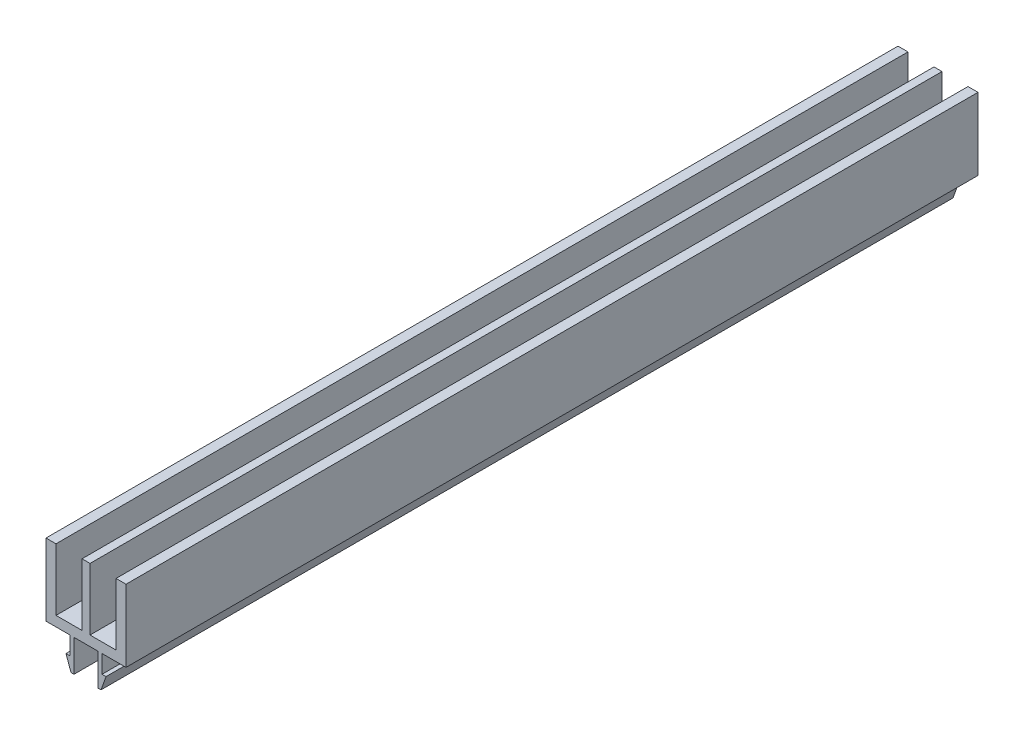
ISO-10303-21;
HEADER;
FILE_DESCRIPTION(('STEP AP214'),'2;1');
FILE_NAME('part.step','',(''),(''),'','','');
FILE_SCHEMA(('AUTOMOTIVE_DESIGN { 1 0 10303 214 1 1 1 1 }'));
ENDSEC;
DATA;
#1=APPLICATION_CONTEXT('core data for automotive mechanical design processes');
#2=APPLICATION_PROTOCOL_DEFINITION('international standard','automotive_design',2000,#1);
#3=PRODUCT_CONTEXT('',#1,'mechanical');
#4=PRODUCT('Part','Part','',(#3));
#5=PRODUCT_RELATED_PRODUCT_CATEGORY('part','',(#4));
#6=PRODUCT_DEFINITION_FORMATION('','',#4);
#7=PRODUCT_DEFINITION_CONTEXT('part definition',#1,'design');
#8=PRODUCT_DEFINITION('design','',#6,#7);
#9=PRODUCT_DEFINITION_SHAPE('','',#8);
#10=(LENGTH_UNIT() NAMED_UNIT(*) SI_UNIT(.MILLI.,.METRE.));
#11=(NAMED_UNIT(*) PLANE_ANGLE_UNIT() SI_UNIT($,.RADIAN.));
#12=(NAMED_UNIT(*) SI_UNIT($,.STERADIAN.) SOLID_ANGLE_UNIT());
#13=UNCERTAINTY_MEASURE_WITH_UNIT(LENGTH_MEASURE(1.E-05),#10,'distance_accuracy_value','');
#14=(GEOMETRIC_REPRESENTATION_CONTEXT(3) GLOBAL_UNCERTAINTY_ASSIGNED_CONTEXT((#13)) GLOBAL_UNIT_ASSIGNED_CONTEXT((#10,
#11,#12)) REPRESENTATION_CONTEXT('',''));
#15=CARTESIAN_POINT('',(0.,0.,0.));
#16=DIRECTION('',(0.,0.,1.));
#17=DIRECTION('',(1.,0.,0.));
#18=AXIS2_PLACEMENT_3D('',#15,#16,#17);
#19=CARTESIAN_POINT('',(-1.,17.9999999975,-162.95));
#20=DIRECTION('',(-1.,0.,0.));
#21=DIRECTION('',(0.,-1.,0.));
#22=AXIS2_PLACEMENT_3D('',#19,#20,#21);
#23=PLANE('',#22);
#24=DIRECTION('',(0.,-1.,0.));
#25=VECTOR('',#24,1.);
#26=CARTESIAN_POINT('',(-1.,17.9999999975,50.));
#27=LINE('',#26,#25);
#28=CARTESIAN_POINT('',(-1.,17.9999999975,50.));
#29=VERTEX_POINT('',#28);
#30=CARTESIAN_POINT('',(-1.,2.4999999995,50.));
#31=VERTEX_POINT('',#30);
#32=EDGE_CURVE('E226',#29,#31,#27,.T.);
#33=ORIENTED_EDGE('',*,*,#32,.F.);
#34=DIRECTION('',(0.,0.,1.));
#35=VECTOR('',#34,1.);
#36=CARTESIAN_POINT('',(-1.,17.9999999975,-162.95));
#37=LINE('',#36,#35);
#38=CARTESIAN_POINT('',(-1.,17.9999999975,-162.95));
#39=VERTEX_POINT('',#38);
#40=EDGE_CURVE('E11',#39,#29,#37,.T.);
#41=ORIENTED_EDGE('',*,*,#40,.F.);
#42=DIRECTION('',(0.,-1.,0.));
#43=VECTOR('',#42,1.);
#44=CARTESIAN_POINT('',(-1.,17.9999999975,-162.95));
#45=LINE('',#44,#43);
#46=CARTESIAN_POINT('',(-1.,2.4999999995,-162.95));
#47=VERTEX_POINT('',#46);
#48=EDGE_CURVE('E294',#39,#47,#45,.T.);
#49=ORIENTED_EDGE('',*,*,#48,.T.);
#50=DIRECTION('',(0.,0.,1.));
#51=VECTOR('',#50,1.);
#52=CARTESIAN_POINT('',(-1.,2.4999999995,-162.95));
#53=LINE('',#52,#51);
#54=EDGE_CURVE('E36',#47,#31,#53,.T.);
#55=ORIENTED_EDGE('',*,*,#54,.T.);
#56=EDGE_LOOP('',(#33,#41,#49,#55));
#57=FACE_BOUND('',#56,.T.);
#58=ADVANCED_FACE('F33',(#57),#23,.T.);
#59=CARTESIAN_POINT('',(0.999999999999998,17.9999999975,-162.95));
#60=DIRECTION('',(0.,1.,0.));
#61=DIRECTION('',(0.,0.,1.));
#62=AXIS2_PLACEMENT_3D('',#59,#60,#61);
#63=PLANE('',#62);
#64=DIRECTION('',(-1.,0.,0.));
#65=VECTOR('',#64,1.);
#66=CARTESIAN_POINT('',(0.999999999999998,17.9999999975,50.));
#67=LINE('',#66,#65);
#68=CARTESIAN_POINT('',(0.999999999999998,17.9999999975,50.));
#69=VERTEX_POINT('',#68);
#70=EDGE_CURVE('E292',#69,#29,#67,.T.);
#71=ORIENTED_EDGE('',*,*,#70,.F.);
#72=DIRECTION('',(0.,0.,1.));
#73=VECTOR('',#72,1.);
#74=CARTESIAN_POINT('',(0.999999999999998,17.9999999975,-162.95));
#75=LINE('',#74,#73);
#76=CARTESIAN_POINT('',(0.999999999999998,17.9999999975,-162.95));
#77=VERTEX_POINT('',#76);
#78=EDGE_CURVE('E42',#77,#69,#75,.T.);
#79=ORIENTED_EDGE('',*,*,#78,.F.);
#80=DIRECTION('',(-1.,0.,0.));
#81=VECTOR('',#80,1.);
#82=CARTESIAN_POINT('',(0.999999999999998,17.9999999975,-162.95));
#83=LINE('',#82,#81);
#84=EDGE_CURVE('E216',#77,#39,#83,.T.);
#85=ORIENTED_EDGE('',*,*,#84,.T.);
#86=ORIENTED_EDGE('',*,*,#40,.T.);
#87=EDGE_LOOP('',(#71,#79,#85,#86));
#88=FACE_BOUND('',#87,.T.);
#89=ADVANCED_FACE('F338',(#88),#63,.T.);
#90=CARTESIAN_POINT('',(0.999999999999998,2.4999999995,-162.95));
#91=DIRECTION('',(1.,0.,0.));
#92=DIRECTION('',(0.,0.,-1.));
#93=AXIS2_PLACEMENT_3D('',#90,#91,#92);
#94=PLANE('',#93);
#95=DIRECTION('',(0.,1.,0.));
#96=VECTOR('',#95,1.);
#97=CARTESIAN_POINT('',(0.999999999999998,2.4999999995,50.));
#98=LINE('',#97,#96);
#99=CARTESIAN_POINT('',(0.999999999999998,2.4999999995,50.));
#100=VERTEX_POINT('',#99);
#101=EDGE_CURVE('E203',#100,#69,#98,.T.);
#102=ORIENTED_EDGE('',*,*,#101,.F.);
#103=DIRECTION('',(0.,0.,1.));
#104=VECTOR('',#103,1.);
#105=CARTESIAN_POINT('',(0.999999999999998,2.4999999995,-162.95));
#106=LINE('',#105,#104);
#107=CARTESIAN_POINT('',(0.999999999999998,2.4999999995,-162.95));
#108=VERTEX_POINT('',#107);
#109=EDGE_CURVE('E198',#108,#100,#106,.T.);
#110=ORIENTED_EDGE('',*,*,#109,.F.);
#111=DIRECTION('',(0.,1.,0.));
#112=VECTOR('',#111,1.);
#113=CARTESIAN_POINT('',(0.999999999999998,2.4999999995,-162.95));
#114=LINE('',#113,#112);
#115=EDGE_CURVE('E201',#108,#77,#114,.T.);
#116=ORIENTED_EDGE('',*,*,#115,.T.);
#117=ORIENTED_EDGE('',*,*,#78,.T.);
#118=EDGE_LOOP('',(#102,#110,#116,#117));
#119=FACE_BOUND('',#118,.T.);
#120=ADVANCED_FACE('F200',(#119),#94,.T.);
#121=CARTESIAN_POINT('',(7.5,2.4999999995,-162.95));
#122=DIRECTION('',(0.,1.,0.));
#123=DIRECTION('',(-1.,0.,0.));
#124=AXIS2_PLACEMENT_3D('',#121,#122,#123);
#125=PLANE('',#124);
#126=DIRECTION('',(-1.,0.,0.));
#127=VECTOR('',#126,1.);
#128=CARTESIAN_POINT('',(7.5,2.4999999995,50.));
#129=LINE('',#128,#127);
#130=CARTESIAN_POINT('',(7.5,2.4999999995,50.));
#131=VERTEX_POINT('',#130);
#132=EDGE_CURVE('E289',#131,#100,#129,.T.);
#133=ORIENTED_EDGE('',*,*,#132,.F.);
#134=DIRECTION('',(0.,0.,1.));
#135=VECTOR('',#134,1.);
#136=CARTESIAN_POINT('',(7.5,2.4999999995,-162.95));
#137=LINE('',#136,#135);
#138=CARTESIAN_POINT('',(7.5,2.4999999995,-162.95));
#139=VERTEX_POINT('',#138);
#140=EDGE_CURVE('E208',#139,#131,#137,.T.);
#141=ORIENTED_EDGE('',*,*,#140,.F.);
#142=DIRECTION('',(-1.,0.,0.));
#143=VECTOR('',#142,1.);
#144=CARTESIAN_POINT('',(7.5,2.4999999995,-162.95));
#145=LINE('',#144,#143);
#146=EDGE_CURVE('E214',#139,#108,#145,.T.);
#147=ORIENTED_EDGE('',*,*,#146,.T.);
#148=ORIENTED_EDGE('',*,*,#109,.T.);
#149=EDGE_LOOP('',(#133,#141,#147,#148));
#150=FACE_BOUND('',#149,.T.);
#151=ADVANCED_FACE('F218',(#150),#125,.T.);
#152=CARTESIAN_POINT('',(7.5,17.9999999975,-162.95));
#153=DIRECTION('',(-1.,0.,0.));
#154=DIRECTION('',(0.,-1.,0.));
#155=AXIS2_PLACEMENT_3D('',#152,#153,#154);
#156=PLANE('',#155);
#157=DIRECTION('',(0.,-1.,0.));
#158=VECTOR('',#157,1.);
#159=CARTESIAN_POINT('',(7.5,17.9999999975,50.));
#160=LINE('',#159,#158);
#161=CARTESIAN_POINT('',(7.5,17.9999999975,50.));
#162=VERTEX_POINT('',#161);
#163=EDGE_CURVE('E286',#162,#131,#160,.T.);
#164=ORIENTED_EDGE('',*,*,#163,.F.);
#165=DIRECTION('',(0.,0.,1.));
#166=VECTOR('',#165,1.);
#167=CARTESIAN_POINT('',(7.5,17.9999999975,-162.95));
#168=LINE('',#167,#166);
#169=CARTESIAN_POINT('',(7.5,17.9999999975,-162.95));
#170=VERTEX_POINT('',#169);
#171=EDGE_CURVE('E298',#170,#162,#168,.T.);
#172=ORIENTED_EDGE('',*,*,#171,.F.);
#173=DIRECTION('',(0.,-1.,0.));
#174=VECTOR('',#173,1.);
#175=CARTESIAN_POINT('',(7.5,17.9999999975,-162.95));
#176=LINE('',#175,#174);
#177=EDGE_CURVE('E219',#170,#139,#176,.T.);
#178=ORIENTED_EDGE('',*,*,#177,.T.);
#179=ORIENTED_EDGE('',*,*,#140,.T.);
#180=EDGE_LOOP('',(#164,#172,#178,#179));
#181=FACE_BOUND('',#180,.T.);
#182=ADVANCED_FACE('F351',(#181),#156,.T.);
#183=CARTESIAN_POINT('',(10.,17.9999999975,-162.95));
#184=DIRECTION('',(0.,1.,0.));
#185=DIRECTION('',(0.,0.,1.));
#186=AXIS2_PLACEMENT_3D('',#183,#184,#185);
#187=PLANE('',#186);
#188=DIRECTION('',(-1.,0.,0.));
#189=VECTOR('',#188,1.);
#190=CARTESIAN_POINT('',(10.,17.9999999975,50.));
#191=LINE('',#190,#189);
#192=CARTESIAN_POINT('',(10.,17.9999999975,50.));
#193=VERTEX_POINT('',#192);
#194=EDGE_CURVE('E283',#193,#162,#191,.T.);
#195=ORIENTED_EDGE('',*,*,#194,.F.);
#196=DIRECTION('',(0.,0.,1.));
#197=VECTOR('',#196,1.);
#198=CARTESIAN_POINT('',(10.,17.9999999975,-162.95));
#199=LINE('',#198,#197);
#200=CARTESIAN_POINT('',(10.,17.9999999975,-162.95));
#201=VERTEX_POINT('',#200);
#202=EDGE_CURVE('E300',#201,#193,#199,.T.);
#203=ORIENTED_EDGE('',*,*,#202,.F.);
#204=DIRECTION('',(-1.,0.,0.));
#205=VECTOR('',#204,1.);
#206=CARTESIAN_POINT('',(10.,17.9999999975,-162.95));
#207=LINE('',#206,#205);
#208=EDGE_CURVE('E221',#201,#170,#207,.T.);
#209=ORIENTED_EDGE('',*,*,#208,.T.);
#210=ORIENTED_EDGE('',*,*,#171,.T.);
#211=EDGE_LOOP('',(#195,#203,#209,#210));
#212=FACE_BOUND('',#211,.T.);
#213=ADVANCED_FACE('F354',(#212),#187,.T.);
#214=CARTESIAN_POINT('',(10.,-4.99999828349541E-10,-162.95));
#215=DIRECTION('',(1.,0.,0.));
#216=DIRECTION('',(0.,0.,-1.));
#217=AXIS2_PLACEMENT_3D('',#214,#215,#216);
#218=PLANE('',#217);
#219=DIRECTION('',(0.,1.,0.));
#220=VECTOR('',#219,1.);
#221=CARTESIAN_POINT('',(10.,-4.99999828349541E-10,50.));
#222=LINE('',#221,#220);
#223=CARTESIAN_POINT('',(10.,-4.99999828349541E-10,50.));
#224=VERTEX_POINT('',#223);
#225=EDGE_CURVE('E280',#224,#193,#222,.T.);
#226=ORIENTED_EDGE('',*,*,#225,.F.);
#227=DIRECTION('',(0.,0.,1.));
#228=VECTOR('',#227,1.);
#229=CARTESIAN_POINT('',(10.,-4.99999828349541E-10,-162.95));
#230=LINE('',#229,#228);
#231=CARTESIAN_POINT('',(10.,-4.99999828349541E-10,-162.95));
#232=VERTEX_POINT('',#231);
#233=EDGE_CURVE('E302',#232,#224,#230,.T.);
#234=ORIENTED_EDGE('',*,*,#233,.F.);
#235=DIRECTION('',(0.,1.,0.));
#236=VECTOR('',#235,1.);
#237=CARTESIAN_POINT('',(10.,-4.99999828349541E-10,-162.95));
#238=LINE('',#237,#236);
#239=EDGE_CURVE('E644',#232,#201,#238,.T.);
#240=ORIENTED_EDGE('',*,*,#239,.T.);
#241=ORIENTED_EDGE('',*,*,#202,.T.);
#242=EDGE_LOOP('',(#226,#234,#240,#241));
#243=FACE_BOUND('',#242,.T.);
#244=ADVANCED_FACE('F358',(#243),#218,.T.);
#245=CARTESIAN_POINT('',(4.,-4.99999998002099E-10,-162.95));
#246=DIRECTION('',(0.,-1.,0.));
#247=DIRECTION('',(1.,0.,0.));
#248=AXIS2_PLACEMENT_3D('',#245,#246,#247);
#249=PLANE('',#248);
#250=DIRECTION('',(1.,0.,0.));
#251=VECTOR('',#250,1.);
#252=CARTESIAN_POINT('',(4.,-4.99999998002099E-10,50.));
#253=LINE('',#252,#251);
#254=CARTESIAN_POINT('',(4.,-4.99999998002099E-10,50.));
#255=VERTEX_POINT('',#254);
#256=EDGE_CURVE('E277',#255,#224,#253,.T.);
#257=ORIENTED_EDGE('',*,*,#256,.F.);
#258=DIRECTION('',(0.,0.,1.));
#259=VECTOR('',#258,1.);
#260=CARTESIAN_POINT('',(4.,-4.99999998002099E-10,-162.95));
#261=LINE('',#260,#259);
#262=CARTESIAN_POINT('',(4.,-4.99999998002099E-10,-162.95));
#263=VERTEX_POINT('',#262);
#264=EDGE_CURVE('E304',#263,#255,#261,.T.);
#265=ORIENTED_EDGE('',*,*,#264,.F.);
#266=DIRECTION('',(1.,0.,0.));
#267=VECTOR('',#266,1.);
#268=CARTESIAN_POINT('',(4.,-4.99999998002099E-10,-162.95));
#269=LINE('',#268,#267);
#270=EDGE_CURVE('E648',#263,#232,#269,.T.);
#271=ORIENTED_EDGE('',*,*,#270,.T.);
#272=ORIENTED_EDGE('',*,*,#233,.T.);
#273=EDGE_LOOP('',(#257,#265,#271,#272));
#274=FACE_BOUND('',#273,.T.);
#275=ADVANCED_FACE('F362',(#274),#249,.T.);
#276=CARTESIAN_POINT('',(4.,-4.5,-162.95));
#277=DIRECTION('',(1.,0.,0.));
#278=DIRECTION('',(0.,0.,-1.));
#279=AXIS2_PLACEMENT_3D('',#276,#277,#278);
#280=PLANE('',#279);
#281=DIRECTION('',(0.,1.,0.));
#282=VECTOR('',#281,1.);
#283=CARTESIAN_POINT('',(4.,-4.5,50.));
#284=LINE('',#283,#282);
#285=CARTESIAN_POINT('',(4.,-4.5,50.));
#286=VERTEX_POINT('',#285);
#287=EDGE_CURVE('E274',#286,#255,#284,.T.);
#288=ORIENTED_EDGE('',*,*,#287,.F.);
#289=DIRECTION('',(0.,0.,1.));
#290=VECTOR('',#289,1.);
#291=CARTESIAN_POINT('',(4.,-4.5,-162.95));
#292=LINE('',#291,#290);
#293=CARTESIAN_POINT('',(4.,-4.5,-162.95));
#294=VERTEX_POINT('',#293);
#295=EDGE_CURVE('E306',#294,#286,#292,.T.);
#296=ORIENTED_EDGE('',*,*,#295,.F.);
#297=DIRECTION('',(0.,1.,0.));
#298=VECTOR('',#297,1.);
#299=CARTESIAN_POINT('',(4.,-4.5,-162.95));
#300=LINE('',#299,#298);
#301=EDGE_CURVE('E637',#294,#263,#300,.T.);
#302=ORIENTED_EDGE('',*,*,#301,.T.);
#303=ORIENTED_EDGE('',*,*,#264,.T.);
#304=EDGE_LOOP('',(#288,#296,#302,#303));
#305=FACE_BOUND('',#304,.T.);
#306=ADVANCED_FACE('F366',(#305),#280,.T.);
#307=CARTESIAN_POINT('',(5.,-4.5,-162.95));
#308=DIRECTION('',(0.,1.,0.));
#309=DIRECTION('',(0.,0.,1.));
#310=AXIS2_PLACEMENT_3D('',#307,#308,#309);
#311=PLANE('',#310);
#312=DIRECTION('',(-1.,0.,0.));
#313=VECTOR('',#312,1.);
#314=CARTESIAN_POINT('',(5.,-4.5,50.));
#315=LINE('',#314,#313);
#316=CARTESIAN_POINT('',(5.,-4.5,50.));
#317=VERTEX_POINT('',#316);
#318=EDGE_CURVE('E271',#317,#286,#315,.T.);
#319=ORIENTED_EDGE('',*,*,#318,.F.);
#320=DIRECTION('',(0.,0.,1.));
#321=VECTOR('',#320,1.);
#322=CARTESIAN_POINT('',(5.,-4.5,-162.95));
#323=LINE('',#322,#321);
#324=CARTESIAN_POINT('',(5.,-4.5,-162.95));
#325=VERTEX_POINT('',#324);
#326=EDGE_CURVE('E308',#325,#317,#323,.T.);
#327=ORIENTED_EDGE('',*,*,#326,.F.);
#328=DIRECTION('',(-1.,0.,0.));
#329=VECTOR('',#328,1.);
#330=CARTESIAN_POINT('',(5.,-4.5,-162.95));
#331=LINE('',#330,#329);
#332=EDGE_CURVE('E633',#325,#294,#331,.T.);
#333=ORIENTED_EDGE('',*,*,#332,.T.);
#334=ORIENTED_EDGE('',*,*,#295,.T.);
#335=EDGE_LOOP('',(#319,#327,#333,#334));
#336=FACE_BOUND('',#335,.T.);
#337=ADVANCED_FACE('F370',(#336),#311,.T.);
#338=CARTESIAN_POINT('',(3.75,-8.,-162.95));
#339=DIRECTION('',(0.941741911594837,-0.336336396998157,0.));
#340=DIRECTION('',(0.336336396998157,0.941741911594837,0.));
#341=AXIS2_PLACEMENT_3D('',#338,#339,#340);
#342=PLANE('',#341);
#343=DIRECTION('',(0.336336396998157,0.941741911594837,0.));
#344=VECTOR('',#343,1.);
#345=CARTESIAN_POINT('',(3.75,-8.,50.));
#346=LINE('',#345,#344);
#347=CARTESIAN_POINT('',(3.75,-8.,50.));
#348=VERTEX_POINT('',#347);
#349=EDGE_CURVE('E268',#348,#317,#346,.T.);
#350=ORIENTED_EDGE('',*,*,#349,.F.);
#351=DIRECTION('',(0.,0.,1.));
#352=VECTOR('',#351,1.);
#353=CARTESIAN_POINT('',(3.75,-8.,-162.95));
#354=LINE('',#353,#352);
#355=CARTESIAN_POINT('',(3.75,-8.,-162.95));
#356=VERTEX_POINT('',#355);
#357=EDGE_CURVE('E310',#356,#348,#354,.T.);
#358=ORIENTED_EDGE('',*,*,#357,.F.);
#359=DIRECTION('',(0.336336396998157,0.941741911594837,0.));
#360=VECTOR('',#359,1.);
#361=CARTESIAN_POINT('',(3.75,-8.,-162.95));
#362=LINE('',#361,#360);
#363=EDGE_CURVE('E654',#356,#325,#362,.T.);
#364=ORIENTED_EDGE('',*,*,#363,.T.);
#365=ORIENTED_EDGE('',*,*,#326,.T.);
#366=EDGE_LOOP('',(#350,#358,#364,#365));
#367=FACE_BOUND('',#366,.T.);
#368=ADVANCED_FACE('F374',(#367),#342,.T.);
#369=CARTESIAN_POINT('',(3.,-8.,-162.95));
#370=DIRECTION('',(0.,-1.,0.));
#371=DIRECTION('',(0.,0.,-1.));
#372=AXIS2_PLACEMENT_3D('',#369,#370,#371);
#373=PLANE('',#372);
#374=DIRECTION('',(1.,0.,0.));
#375=VECTOR('',#374,1.);
#376=CARTESIAN_POINT('',(3.,-8.,50.));
#377=LINE('',#376,#375);
#378=CARTESIAN_POINT('',(3.,-8.,50.));
#379=VERTEX_POINT('',#378);
#380=EDGE_CURVE('E265',#379,#348,#377,.T.);
#381=ORIENTED_EDGE('',*,*,#380,.F.);
#382=DIRECTION('',(0.,0.,1.));
#383=VECTOR('',#382,1.);
#384=CARTESIAN_POINT('',(3.,-8.,-162.95));
#385=LINE('',#384,#383);
#386=CARTESIAN_POINT('',(3.,-8.,-162.95));
#387=VERTEX_POINT('',#386);
#388=EDGE_CURVE('E312',#387,#379,#385,.T.);
#389=ORIENTED_EDGE('',*,*,#388,.F.);
#390=DIRECTION('',(1.,0.,0.));
#391=VECTOR('',#390,1.);
#392=CARTESIAN_POINT('',(3.,-8.,-162.95));
#393=LINE('',#392,#391);
#394=EDGE_CURVE('E626',#387,#356,#393,.T.);
#395=ORIENTED_EDGE('',*,*,#394,.T.);
#396=ORIENTED_EDGE('',*,*,#357,.T.);
#397=EDGE_LOOP('',(#381,#389,#395,#396));
#398=FACE_BOUND('',#397,.T.);
#399=ADVANCED_FACE('F378',(#398),#373,.T.);
#400=CARTESIAN_POINT('',(3.,-4.9999985194348E-10,-162.95));
#401=DIRECTION('',(-1.,0.,0.));
#402=DIRECTION('',(0.,0.,1.));
#403=AXIS2_PLACEMENT_3D('',#400,#401,#402);
#404=PLANE('',#403);
#405=DIRECTION('',(0.,-1.,0.));
#406=VECTOR('',#405,1.);
#407=CARTESIAN_POINT('',(3.,-4.9999985194348E-10,50.));
#408=LINE('',#407,#406);
#409=CARTESIAN_POINT('',(3.,-4.9999985194348E-10,50.));
#410=VERTEX_POINT('',#409);
#411=EDGE_CURVE('E262',#410,#379,#408,.T.);
#412=ORIENTED_EDGE('',*,*,#411,.F.);
#413=DIRECTION('',(0.,0.,1.));
#414=VECTOR('',#413,1.);
#415=CARTESIAN_POINT('',(3.,-4.9999985194348E-10,-162.95));
#416=LINE('',#415,#414);
#417=CARTESIAN_POINT('',(3.,-4.9999985194348E-10,-162.95));
#418=VERTEX_POINT('',#417);
#419=EDGE_CURVE('E314',#418,#410,#416,.T.);
#420=ORIENTED_EDGE('',*,*,#419,.F.);
#421=DIRECTION('',(0.,-1.,0.));
#422=VECTOR('',#421,1.);
#423=CARTESIAN_POINT('',(3.,-4.9999985194348E-10,-162.95));
#424=LINE('',#423,#422);
#425=EDGE_CURVE('E622',#418,#387,#424,.T.);
#426=ORIENTED_EDGE('',*,*,#425,.T.);
#427=ORIENTED_EDGE('',*,*,#388,.T.);
#428=EDGE_LOOP('',(#412,#420,#426,#427));
#429=FACE_BOUND('',#428,.T.);
#430=ADVANCED_FACE('F382',(#429),#404,.T.);
#431=CARTESIAN_POINT('',(-3.,-4.99999455901012E-10,-162.95));
#432=DIRECTION('',(0.,-1.,0.));
#433=DIRECTION('',(1.,0.,0.));
#434=AXIS2_PLACEMENT_3D('',#431,#432,#433);
#435=PLANE('',#434);
#436=DIRECTION('',(1.,0.,0.));
#437=VECTOR('',#436,1.);
#438=CARTESIAN_POINT('',(-3.,-4.99999455901012E-10,50.));
#439=LINE('',#438,#437);
#440=CARTESIAN_POINT('',(-3.,-4.99999455901012E-10,50.));
#441=VERTEX_POINT('',#440);
#442=EDGE_CURVE('E259',#441,#410,#439,.T.);
#443=ORIENTED_EDGE('',*,*,#442,.F.);
#444=DIRECTION('',(0.,0.,1.));
#445=VECTOR('',#444,1.);
#446=CARTESIAN_POINT('',(-3.,-4.99999455901012E-10,-162.95));
#447=LINE('',#446,#445);
#448=CARTESIAN_POINT('',(-3.,-4.99999455901012E-10,-162.95));
#449=VERTEX_POINT('',#448);
#450=EDGE_CURVE('E316',#449,#441,#447,.T.);
#451=ORIENTED_EDGE('',*,*,#450,.F.);
#452=DIRECTION('',(1.,0.,0.));
#453=VECTOR('',#452,1.);
#454=CARTESIAN_POINT('',(-3.,-4.99999455901012E-10,-162.95));
#455=LINE('',#454,#453);
#456=EDGE_CURVE('E658',#449,#418,#455,.T.);
#457=ORIENTED_EDGE('',*,*,#456,.T.);
#458=ORIENTED_EDGE('',*,*,#419,.T.);
#459=EDGE_LOOP('',(#443,#451,#457,#458));
#460=FACE_BOUND('',#459,.T.);
#461=ADVANCED_FACE('F386',(#460),#435,.T.);
#462=CARTESIAN_POINT('',(-3.,-8.,-162.95));
#463=DIRECTION('',(1.,0.,0.));
#464=DIRECTION('',(0.,0.,-1.));
#465=AXIS2_PLACEMENT_3D('',#462,#463,#464);
#466=PLANE('',#465);
#467=DIRECTION('',(0.,1.,0.));
#468=VECTOR('',#467,1.);
#469=CARTESIAN_POINT('',(-3.,-8.,50.));
#470=LINE('',#469,#468);
#471=CARTESIAN_POINT('',(-3.,-8.,50.));
#472=VERTEX_POINT('',#471);
#473=EDGE_CURVE('E256',#472,#441,#470,.T.);
#474=ORIENTED_EDGE('',*,*,#473,.F.);
#475=DIRECTION('',(0.,0.,1.));
#476=VECTOR('',#475,1.);
#477=CARTESIAN_POINT('',(-3.,-8.,-162.95));
#478=LINE('',#477,#476);
#479=CARTESIAN_POINT('',(-3.,-8.,-162.95));
#480=VERTEX_POINT('',#479);
#481=EDGE_CURVE('E318',#480,#472,#478,.T.);
#482=ORIENTED_EDGE('',*,*,#481,.F.);
#483=DIRECTION('',(0.,1.,0.));
#484=VECTOR('',#483,1.);
#485=CARTESIAN_POINT('',(-3.,-8.,-162.95));
#486=LINE('',#485,#484);
#487=EDGE_CURVE('E615',#480,#449,#486,.T.);
#488=ORIENTED_EDGE('',*,*,#487,.T.);
#489=ORIENTED_EDGE('',*,*,#450,.T.);
#490=EDGE_LOOP('',(#474,#482,#488,#489));
#491=FACE_BOUND('',#490,.T.);
#492=ADVANCED_FACE('F390',(#491),#466,.T.);
#493=CARTESIAN_POINT('',(-3.75,-8.,-162.95));
#494=DIRECTION('',(0.,-1.,0.));
#495=DIRECTION('',(0.,0.,-1.));
#496=AXIS2_PLACEMENT_3D('',#493,#494,#495);
#497=PLANE('',#496);
#498=DIRECTION('',(1.,0.,0.));
#499=VECTOR('',#498,1.);
#500=CARTESIAN_POINT('',(-3.75,-8.,50.));
#501=LINE('',#500,#499);
#502=CARTESIAN_POINT('',(-3.75,-8.,50.));
#503=VERTEX_POINT('',#502);
#504=EDGE_CURVE('E253',#503,#472,#501,.T.);
#505=ORIENTED_EDGE('',*,*,#504,.F.);
#506=DIRECTION('',(0.,0.,1.));
#507=VECTOR('',#506,1.);
#508=CARTESIAN_POINT('',(-3.75,-8.,-162.95));
#509=LINE('',#508,#507);
#510=CARTESIAN_POINT('',(-3.75,-8.,-162.95));
#511=VERTEX_POINT('',#510);
#512=EDGE_CURVE('E320',#511,#503,#509,.T.);
#513=ORIENTED_EDGE('',*,*,#512,.F.);
#514=DIRECTION('',(1.,0.,0.));
#515=VECTOR('',#514,1.);
#516=CARTESIAN_POINT('',(-3.75,-8.,-162.95));
#517=LINE('',#516,#515);
#518=EDGE_CURVE('E611',#511,#480,#517,.T.);
#519=ORIENTED_EDGE('',*,*,#518,.T.);
#520=ORIENTED_EDGE('',*,*,#481,.T.);
#521=EDGE_LOOP('',(#505,#513,#519,#520));
#522=FACE_BOUND('',#521,.T.);
#523=ADVANCED_FACE('F394',(#522),#497,.T.);
#524=CARTESIAN_POINT('',(-5.,-4.5,-162.95));
#525=DIRECTION('',(-0.941741911594837,-0.336336396998156,0.));
#526=DIRECTION('',(0.336336396998156,-0.941741911594837,0.));
#527=AXIS2_PLACEMENT_3D('',#524,#525,#526);
#528=PLANE('',#527);
#529=DIRECTION('',(0.336336396998156,-0.941741911594837,0.));
#530=VECTOR('',#529,1.);
#531=CARTESIAN_POINT('',(-5.,-4.5,50.));
#532=LINE('',#531,#530);
#533=CARTESIAN_POINT('',(-5.,-4.5,50.));
#534=VERTEX_POINT('',#533);
#535=EDGE_CURVE('E250',#534,#503,#532,.T.);
#536=ORIENTED_EDGE('',*,*,#535,.F.);
#537=DIRECTION('',(0.,0.,1.));
#538=VECTOR('',#537,1.);
#539=CARTESIAN_POINT('',(-5.,-4.5,-162.95));
#540=LINE('',#539,#538);
#541=CARTESIAN_POINT('',(-5.,-4.5,-162.95));
#542=VERTEX_POINT('',#541);
#543=EDGE_CURVE('E322',#542,#534,#540,.T.);
#544=ORIENTED_EDGE('',*,*,#543,.F.);
#545=DIRECTION('',(0.336336396998156,-0.941741911594837,0.));
#546=VECTOR('',#545,1.);
#547=CARTESIAN_POINT('',(-5.,-4.5,-162.95));
#548=LINE('',#547,#546);
#549=EDGE_CURVE('E662',#542,#511,#548,.T.);
#550=ORIENTED_EDGE('',*,*,#549,.T.);
#551=ORIENTED_EDGE('',*,*,#512,.T.);
#552=EDGE_LOOP('',(#536,#544,#550,#551));
#553=FACE_BOUND('',#552,.T.);
#554=ADVANCED_FACE('F398',(#553),#528,.T.);
#555=CARTESIAN_POINT('',(-4.,-4.5,-162.95));
#556=DIRECTION('',(0.,1.,0.));
#557=DIRECTION('',(0.,0.,1.));
#558=AXIS2_PLACEMENT_3D('',#555,#556,#557);
#559=PLANE('',#558);
#560=DIRECTION('',(-1.,0.,0.));
#561=VECTOR('',#560,1.);
#562=CARTESIAN_POINT('',(-4.,-4.5,50.));
#563=LINE('',#562,#561);
#564=CARTESIAN_POINT('',(-4.,-4.5,50.));
#565=VERTEX_POINT('',#564);
#566=EDGE_CURVE('E247',#565,#534,#563,.T.);
#567=ORIENTED_EDGE('',*,*,#566,.F.);
#568=DIRECTION('',(0.,0.,1.));
#569=VECTOR('',#568,1.);
#570=CARTESIAN_POINT('',(-4.,-4.5,-162.95));
#571=LINE('',#570,#569);
#572=CARTESIAN_POINT('',(-4.,-4.5,-162.95));
#573=VERTEX_POINT('',#572);
#574=EDGE_CURVE('E324',#573,#565,#571,.T.);
#575=ORIENTED_EDGE('',*,*,#574,.F.);
#576=DIRECTION('',(-1.,0.,0.));
#577=VECTOR('',#576,1.);
#578=CARTESIAN_POINT('',(-4.,-4.5,-162.95));
#579=LINE('',#578,#577);
#580=EDGE_CURVE('E604',#573,#542,#579,.T.);
#581=ORIENTED_EDGE('',*,*,#580,.T.);
#582=ORIENTED_EDGE('',*,*,#543,.T.);
#583=EDGE_LOOP('',(#567,#575,#581,#582));
#584=FACE_BOUND('',#583,.T.);
#585=ADVANCED_FACE('F402',(#584),#559,.T.);
#586=CARTESIAN_POINT('',(-4.,-4.9999985194348E-10,-162.95));
#587=DIRECTION('',(-1.,0.,0.));
#588=DIRECTION('',(0.,0.,1.));
#589=AXIS2_PLACEMENT_3D('',#586,#587,#588);
#590=PLANE('',#589);
#591=DIRECTION('',(0.,-1.,0.));
#592=VECTOR('',#591,1.);
#593=CARTESIAN_POINT('',(-4.,-4.9999985194348E-10,50.));
#594=LINE('',#593,#592);
#595=CARTESIAN_POINT('',(-4.,-4.9999985194348E-10,50.));
#596=VERTEX_POINT('',#595);
#597=EDGE_CURVE('E244',#596,#565,#594,.T.);
#598=ORIENTED_EDGE('',*,*,#597,.F.);
#599=DIRECTION('',(0.,0.,1.));
#600=VECTOR('',#599,1.);
#601=CARTESIAN_POINT('',(-4.,-4.9999985194348E-10,-162.95));
#602=LINE('',#601,#600);
#603=CARTESIAN_POINT('',(-4.,-4.9999985194348E-10,-162.95));
#604=VERTEX_POINT('',#603);
#605=EDGE_CURVE('E326',#604,#596,#602,.T.);
#606=ORIENTED_EDGE('',*,*,#605,.F.);
#607=DIRECTION('',(0.,-1.,0.));
#608=VECTOR('',#607,1.);
#609=CARTESIAN_POINT('',(-4.,-4.9999985194348E-10,-162.95));
#610=LINE('',#609,#608);
#611=EDGE_CURVE('E600',#604,#573,#610,.T.);
#612=ORIENTED_EDGE('',*,*,#611,.T.);
#613=ORIENTED_EDGE('',*,*,#574,.T.);
#614=EDGE_LOOP('',(#598,#606,#612,#613));
#615=FACE_BOUND('',#614,.T.);
#616=ADVANCED_FACE('F406',(#615),#590,.T.);
#617=CARTESIAN_POINT('',(-10.,-4.99999719929324E-10,-162.95));
#618=DIRECTION('',(0.,-1.,0.));
#619=DIRECTION('',(1.,0.,0.));
#620=AXIS2_PLACEMENT_3D('',#617,#618,#619);
#621=PLANE('',#620);
#622=DIRECTION('',(1.,0.,0.));
#623=VECTOR('',#622,1.);
#624=CARTESIAN_POINT('',(-10.,-4.99999719929324E-10,50.));
#625=LINE('',#624,#623);
#626=CARTESIAN_POINT('',(-10.,-4.99999719929324E-10,50.));
#627=VERTEX_POINT('',#626);
#628=EDGE_CURVE('E241',#627,#596,#625,.T.);
#629=ORIENTED_EDGE('',*,*,#628,.F.);
#630=DIRECTION('',(0.,0.,1.));
#631=VECTOR('',#630,1.);
#632=CARTESIAN_POINT('',(-10.,-4.99999719929324E-10,-162.95));
#633=LINE('',#632,#631);
#634=CARTESIAN_POINT('',(-10.,-4.99999719929324E-10,-162.95));
#635=VERTEX_POINT('',#634);
#636=EDGE_CURVE('E328',#635,#627,#633,.T.);
#637=ORIENTED_EDGE('',*,*,#636,.F.);
#638=DIRECTION('',(1.,0.,0.));
#639=VECTOR('',#638,1.);
#640=CARTESIAN_POINT('',(-10.,-4.99999719929324E-10,-162.95));
#641=LINE('',#640,#639);
#642=EDGE_CURVE('E666',#635,#604,#641,.T.);
#643=ORIENTED_EDGE('',*,*,#642,.T.);
#644=ORIENTED_EDGE('',*,*,#605,.T.);
#645=EDGE_LOOP('',(#629,#637,#643,#644));
#646=FACE_BOUND('',#645,.T.);
#647=ADVANCED_FACE('F410',(#646),#621,.T.);
#648=CARTESIAN_POINT('',(-10.,17.9999999975,-162.95));
#649=DIRECTION('',(-1.,0.,0.));
#650=DIRECTION('',(0.,-1.,0.));
#651=AXIS2_PLACEMENT_3D('',#648,#649,#650);
#652=PLANE('',#651);
#653=DIRECTION('',(0.,-1.,0.));
#654=VECTOR('',#653,1.);
#655=CARTESIAN_POINT('',(-10.,17.9999999975,50.));
#656=LINE('',#655,#654);
#657=CARTESIAN_POINT('',(-10.,17.9999999975,50.));
#658=VERTEX_POINT('',#657);
#659=EDGE_CURVE('E238',#658,#627,#656,.T.);
#660=ORIENTED_EDGE('',*,*,#659,.F.);
#661=DIRECTION('',(0.,0.,1.));
#662=VECTOR('',#661,1.);
#663=CARTESIAN_POINT('',(-10.,17.9999999975,-162.95));
#664=LINE('',#663,#662);
#665=CARTESIAN_POINT('',(-10.,17.9999999975,-162.95));
#666=VERTEX_POINT('',#665);
#667=EDGE_CURVE('E330',#666,#658,#664,.T.);
#668=ORIENTED_EDGE('',*,*,#667,.F.);
#669=DIRECTION('',(0.,-1.,0.));
#670=VECTOR('',#669,1.);
#671=CARTESIAN_POINT('',(-10.,17.9999999975,-162.95));
#672=LINE('',#671,#670);
#673=EDGE_CURVE('E593',#666,#635,#672,.T.);
#674=ORIENTED_EDGE('',*,*,#673,.T.);
#675=ORIENTED_EDGE('',*,*,#636,.T.);
#676=EDGE_LOOP('',(#660,#668,#674,#675));
#677=FACE_BOUND('',#676,.T.);
#678=ADVANCED_FACE('F414',(#677),#652,.T.);
#679=CARTESIAN_POINT('',(-7.5,17.9999999975,-162.95));
#680=DIRECTION('',(0.,1.,0.));
#681=DIRECTION('',(0.,0.,1.));
#682=AXIS2_PLACEMENT_3D('',#679,#680,#681);
#683=PLANE('',#682);
#684=DIRECTION('',(-1.,0.,0.));
#685=VECTOR('',#684,1.);
#686=CARTESIAN_POINT('',(-7.5,17.9999999975,50.));
#687=LINE('',#686,#685);
#688=CARTESIAN_POINT('',(-7.5,17.9999999975,50.));
#689=VERTEX_POINT('',#688);
#690=EDGE_CURVE('E235',#689,#658,#687,.T.);
#691=ORIENTED_EDGE('',*,*,#690,.F.);
#692=DIRECTION('',(0.,0.,1.));
#693=VECTOR('',#692,1.);
#694=CARTESIAN_POINT('',(-7.5,17.9999999975,-162.95));
#695=LINE('',#694,#693);
#696=CARTESIAN_POINT('',(-7.5,17.9999999975,-162.95));
#697=VERTEX_POINT('',#696);
#698=EDGE_CURVE('E332',#697,#689,#695,.T.);
#699=ORIENTED_EDGE('',*,*,#698,.F.);
#700=DIRECTION('',(-1.,0.,0.));
#701=VECTOR('',#700,1.);
#702=CARTESIAN_POINT('',(-7.5,17.9999999975,-162.95));
#703=LINE('',#702,#701);
#704=EDGE_CURVE('E589',#697,#666,#703,.T.);
#705=ORIENTED_EDGE('',*,*,#704,.T.);
#706=ORIENTED_EDGE('',*,*,#667,.T.);
#707=EDGE_LOOP('',(#691,#699,#705,#706));
#708=FACE_BOUND('',#707,.T.);
#709=ADVANCED_FACE('F418',(#708),#683,.T.);
#710=CARTESIAN_POINT('',(-7.5,2.4999999995,-162.95));
#711=DIRECTION('',(1.,0.,0.));
#712=DIRECTION('',(0.,0.,-1.));
#713=AXIS2_PLACEMENT_3D('',#710,#711,#712);
#714=PLANE('',#713);
#715=DIRECTION('',(0.,1.,0.));
#716=VECTOR('',#715,1.);
#717=CARTESIAN_POINT('',(-7.5,2.4999999995,50.));
#718=LINE('',#717,#716);
#719=CARTESIAN_POINT('',(-7.5,2.4999999995,50.));
#720=VERTEX_POINT('',#719);
#721=EDGE_CURVE('E232',#720,#689,#718,.T.);
#722=ORIENTED_EDGE('',*,*,#721,.F.);
#723=DIRECTION('',(0.,0.,1.));
#724=VECTOR('',#723,1.);
#725=CARTESIAN_POINT('',(-7.5,2.4999999995,-162.95));
#726=LINE('',#725,#724);
#727=CARTESIAN_POINT('',(-7.5,2.4999999995,-162.95));
#728=VERTEX_POINT('',#727);
#729=EDGE_CURVE('E333',#728,#720,#726,.T.);
#730=ORIENTED_EDGE('',*,*,#729,.F.);
#731=DIRECTION('',(0.,1.,0.));
#732=VECTOR('',#731,1.);
#733=CARTESIAN_POINT('',(-7.5,2.4999999995,-162.95));
#734=LINE('',#733,#732);
#735=EDGE_CURVE('E670',#728,#697,#734,.T.);
#736=ORIENTED_EDGE('',*,*,#735,.T.);
#737=ORIENTED_EDGE('',*,*,#698,.T.);
#738=EDGE_LOOP('',(#722,#730,#736,#737));
#739=FACE_BOUND('',#738,.T.);
#740=ADVANCED_FACE('F422',(#739),#714,.T.);
#741=CARTESIAN_POINT('',(-1.,2.4999999995,-162.95));
#742=DIRECTION('',(0.,1.,0.));
#743=DIRECTION('',(-1.,0.,0.));
#744=AXIS2_PLACEMENT_3D('',#741,#742,#743);
#745=PLANE('',#744);
#746=DIRECTION('',(-1.,0.,0.));
#747=VECTOR('',#746,1.);
#748=CARTESIAN_POINT('',(-1.,2.4999999995,50.));
#749=LINE('',#748,#747);
#750=EDGE_CURVE('E229',#31,#720,#749,.T.);
#751=ORIENTED_EDGE('',*,*,#750,.F.);
#752=ORIENTED_EDGE('',*,*,#54,.F.);
#753=DIRECTION('',(-1.,0.,0.));
#754=VECTOR('',#753,1.);
#755=CARTESIAN_POINT('',(-1.,2.4999999995,-162.95));
#756=LINE('',#755,#754);
#757=EDGE_CURVE('E672',#47,#728,#756,.T.);
#758=ORIENTED_EDGE('',*,*,#757,.T.);
#759=ORIENTED_EDGE('',*,*,#729,.T.);
#760=EDGE_LOOP('',(#751,#752,#758,#759));
#761=FACE_BOUND('',#760,.T.);
#762=ADVANCED_FACE('F335',(#761),#745,.T.);
#763=CARTESIAN_POINT('',(0.,0.,-162.95));
#764=DIRECTION('',(0.,0.,-1.));
#765=DIRECTION('',(-1.,0.,0.));
#766=AXIS2_PLACEMENT_3D('',#763,#764,#765);
#767=PLANE('',#766);
#768=ORIENTED_EDGE('',*,*,#48,.F.);
#769=ORIENTED_EDGE('',*,*,#84,.F.);
#770=ORIENTED_EDGE('',*,*,#115,.F.);
#771=ORIENTED_EDGE('',*,*,#146,.F.);
#772=ORIENTED_EDGE('',*,*,#177,.F.);
#773=ORIENTED_EDGE('',*,*,#208,.F.);
#774=ORIENTED_EDGE('',*,*,#239,.F.);
#775=ORIENTED_EDGE('',*,*,#270,.F.);
#776=ORIENTED_EDGE('',*,*,#301,.F.);
#777=ORIENTED_EDGE('',*,*,#332,.F.);
#778=ORIENTED_EDGE('',*,*,#363,.F.);
#779=ORIENTED_EDGE('',*,*,#394,.F.);
#780=ORIENTED_EDGE('',*,*,#425,.F.);
#781=ORIENTED_EDGE('',*,*,#456,.F.);
#782=ORIENTED_EDGE('',*,*,#487,.F.);
#783=ORIENTED_EDGE('',*,*,#518,.F.);
#784=ORIENTED_EDGE('',*,*,#549,.F.);
#785=ORIENTED_EDGE('',*,*,#580,.F.);
#786=ORIENTED_EDGE('',*,*,#611,.F.);
#787=ORIENTED_EDGE('',*,*,#642,.F.);
#788=ORIENTED_EDGE('',*,*,#673,.F.);
#789=ORIENTED_EDGE('',*,*,#704,.F.);
#790=ORIENTED_EDGE('',*,*,#735,.F.);
#791=ORIENTED_EDGE('',*,*,#757,.F.);
#792=EDGE_LOOP('',(#768,#769,#770,#771,#772,#773,#774,#775,#776,#777,#778,#779,#780,#781,#782,
#783,#784,#785,#786,#787,#788,#789,#790,#791));
#793=FACE_BOUND('',#792,.T.);
#794=ADVANCED_FACE('F212',(#793),#767,.T.);
#795=CARTESIAN_POINT('',(0.,0.,50.));
#796=DIRECTION('',(0.,0.,-1.));
#797=DIRECTION('',(-1.,0.,0.));
#798=AXIS2_PLACEMENT_3D('',#795,#796,#797);
#799=PLANE('',#798);
#800=ORIENTED_EDGE('',*,*,#32,.T.);
#801=ORIENTED_EDGE('',*,*,#750,.T.);
#802=ORIENTED_EDGE('',*,*,#721,.T.);
#803=ORIENTED_EDGE('',*,*,#690,.T.);
#804=ORIENTED_EDGE('',*,*,#659,.T.);
#805=ORIENTED_EDGE('',*,*,#628,.T.);
#806=ORIENTED_EDGE('',*,*,#597,.T.);
#807=ORIENTED_EDGE('',*,*,#566,.T.);
#808=ORIENTED_EDGE('',*,*,#535,.T.);
#809=ORIENTED_EDGE('',*,*,#504,.T.);
#810=ORIENTED_EDGE('',*,*,#473,.T.);
#811=ORIENTED_EDGE('',*,*,#442,.T.);
#812=ORIENTED_EDGE('',*,*,#411,.T.);
#813=ORIENTED_EDGE('',*,*,#380,.T.);
#814=ORIENTED_EDGE('',*,*,#349,.T.);
#815=ORIENTED_EDGE('',*,*,#318,.T.);
#816=ORIENTED_EDGE('',*,*,#287,.T.);
#817=ORIENTED_EDGE('',*,*,#256,.T.);
#818=ORIENTED_EDGE('',*,*,#225,.T.);
#819=ORIENTED_EDGE('',*,*,#194,.T.);
#820=ORIENTED_EDGE('',*,*,#163,.T.);
#821=ORIENTED_EDGE('',*,*,#132,.T.);
#822=ORIENTED_EDGE('',*,*,#101,.T.);
#823=ORIENTED_EDGE('',*,*,#70,.T.);
#824=EDGE_LOOP('',(#800,#801,#802,#803,#804,#805,#806,#807,#808,#809,#810,#811,#812,#813,#814,
#815,#816,#817,#818,#819,#820,#821,#822,#823));
#825=FACE_BOUND('',#824,.T.);
#826=ADVANCED_FACE('F337',(#825),#799,.F.);
#827=CLOSED_SHELL('',(#58,#89,#120,#151,#182,#213,#244,#275,#306,#337,#368,#399,#430,#461,#492,
#523,#554,#585,#616,#647,#678,#709,#740,#762,#794,#826));
#828=MANIFOLD_SOLID_BREP('B2',#827);
#829=ADVANCED_BREP_SHAPE_REPRESENTATION('',(#18,#828),#14);
#830=SHAPE_DEFINITION_REPRESENTATION(#9,#829);
ENDSEC;
END-ISO-10303-21;
